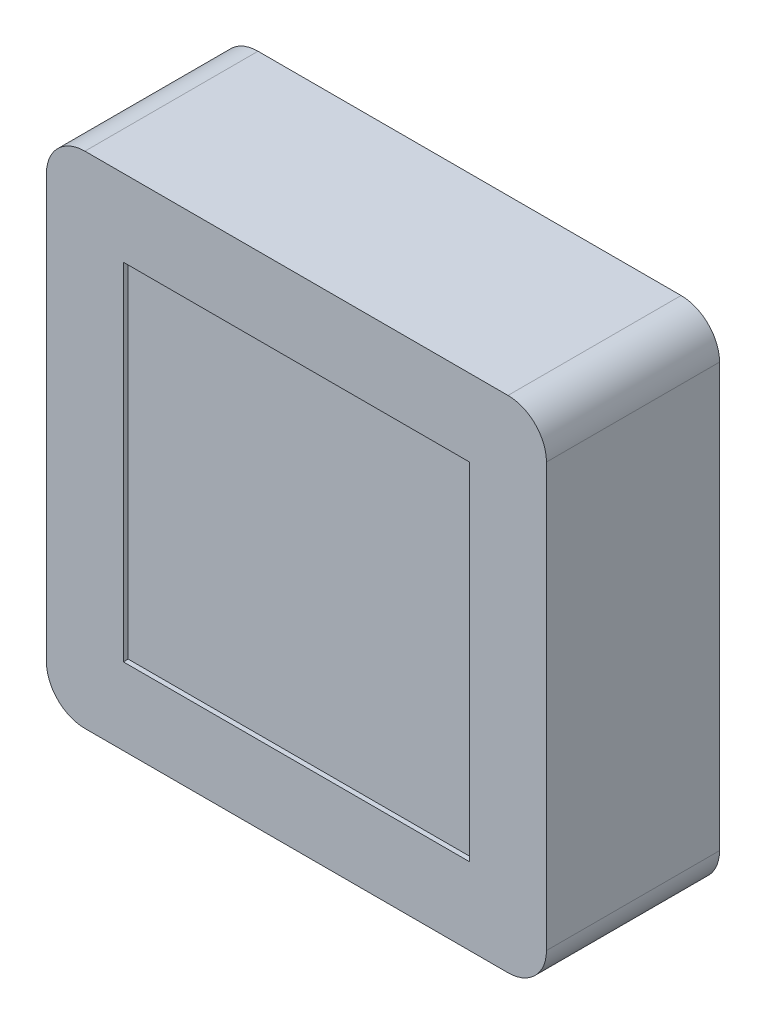
ISO-10303-21;
HEADER;
FILE_DESCRIPTION(('STEP AP214'),'2;1');
FILE_NAME('part.step','',(''),(''),'','','');
FILE_SCHEMA(('AUTOMOTIVE_DESIGN { 1 0 10303 214 1 1 1 1 }'));
ENDSEC;
DATA;
#1=APPLICATION_CONTEXT('core data for automotive mechanical design processes');
#2=APPLICATION_PROTOCOL_DEFINITION('international standard','automotive_design',2000,#1);
#3=PRODUCT_CONTEXT('',#1,'mechanical');
#4=PRODUCT('Part','Part','',(#3));
#5=PRODUCT_RELATED_PRODUCT_CATEGORY('part','',(#4));
#6=PRODUCT_DEFINITION_FORMATION('','',#4);
#7=PRODUCT_DEFINITION_CONTEXT('part definition',#1,'design');
#8=PRODUCT_DEFINITION('design','',#6,#7);
#9=PRODUCT_DEFINITION_SHAPE('','',#8);
#10=(LENGTH_UNIT() NAMED_UNIT(*) SI_UNIT(.MILLI.,.METRE.));
#11=(NAMED_UNIT(*) PLANE_ANGLE_UNIT() SI_UNIT($,.RADIAN.));
#12=(NAMED_UNIT(*) SI_UNIT($,.STERADIAN.) SOLID_ANGLE_UNIT());
#13=UNCERTAINTY_MEASURE_WITH_UNIT(LENGTH_MEASURE(1.E-05),#10,'distance_accuracy_value','');
#14=(GEOMETRIC_REPRESENTATION_CONTEXT(3) GLOBAL_UNCERTAINTY_ASSIGNED_CONTEXT((#13)) GLOBAL_UNIT_ASSIGNED_CONTEXT((#10,
#11,#12)) REPRESENTATION_CONTEXT('',''));
#15=CARTESIAN_POINT('',(0.,0.,0.));
#16=DIRECTION('',(0.,0.,1.));
#17=DIRECTION('',(1.,0.,0.));
#18=AXIS2_PLACEMENT_3D('',#15,#16,#17);
#19=CARTESIAN_POINT('',(-13.,13.,4.5));
#20=DIRECTION('',(1.,0.,0.));
#21=DIRECTION('',(0.,0.,-1.));
#22=AXIS2_PLACEMENT_3D('',#19,#20,#21);
#23=PLANE('',#22);
#24=DIRECTION('',(0.,-1.,0.));
#25=VECTOR('',#24,1.);
#26=CARTESIAN_POINT('',(-13.,13.,-4.5));
#27=LINE('',#26,#25);
#28=CARTESIAN_POINT('',(-13.,11.,-4.5));
#29=VERTEX_POINT('',#28);
#30=CARTESIAN_POINT('',(-13.,-11.,-4.5));
#31=VERTEX_POINT('',#30);
#32=EDGE_CURVE('E157',#29,#31,#27,.T.);
#33=ORIENTED_EDGE('',*,*,#32,.T.);
#34=DIRECTION('',(0.,0.,-1.));
#35=VECTOR('',#34,1.);
#36=CARTESIAN_POINT('',(-13.,-11.,4.5));
#37=LINE('',#36,#35);
#38=CARTESIAN_POINT('',(-13.,-11.,4.5));
#39=VERTEX_POINT('',#38);
#40=EDGE_CURVE('E199',#31,#39,#37,.F.);
#41=ORIENTED_EDGE('',*,*,#40,.T.);
#42=DIRECTION('',(0.,-1.,0.));
#43=VECTOR('',#42,1.);
#44=CARTESIAN_POINT('',(-13.,13.,4.5));
#45=LINE('',#44,#43);
#46=CARTESIAN_POINT('',(-13.,11.,4.5));
#47=VERTEX_POINT('',#46);
#48=EDGE_CURVE('E162',#47,#39,#45,.T.);
#49=ORIENTED_EDGE('',*,*,#48,.F.);
#50=DIRECTION('',(0.,0.,-1.));
#51=VECTOR('',#50,1.);
#52=CARTESIAN_POINT('',(-13.,11.,4.5));
#53=LINE('',#52,#51);
#54=EDGE_CURVE('E196',#47,#29,#53,.T.);
#55=ORIENTED_EDGE('',*,*,#54,.T.);
#56=EDGE_LOOP('',(#33,#41,#49,#55));
#57=FACE_BOUND('',#56,.T.);
#58=ADVANCED_FACE('F34',(#57),#23,.F.);
#59=CARTESIAN_POINT('',(-13.,-13.,4.5));
#60=DIRECTION('',(0.,1.,0.));
#61=DIRECTION('',(0.,0.,1.));
#62=AXIS2_PLACEMENT_3D('',#59,#60,#61);
#63=PLANE('',#62);
#64=DIRECTION('',(1.,0.,0.));
#65=VECTOR('',#64,1.);
#66=CARTESIAN_POINT('',(-13.,-13.,4.5));
#67=LINE('',#66,#65);
#68=CARTESIAN_POINT('',(-11.,-13.,4.5));
#69=VERTEX_POINT('',#68);
#70=CARTESIAN_POINT('',(11.,-13.,4.5));
#71=VERTEX_POINT('',#70);
#72=EDGE_CURVE('E165',#69,#71,#67,.T.);
#73=ORIENTED_EDGE('',*,*,#72,.F.);
#74=DIRECTION('',(0.,0.,-1.));
#75=VECTOR('',#74,1.);
#76=CARTESIAN_POINT('',(-11.,-13.,4.5));
#77=LINE('',#76,#75);
#78=CARTESIAN_POINT('',(-11.,-13.,-4.5));
#79=VERTEX_POINT('',#78);
#80=EDGE_CURVE('E185',#69,#79,#77,.T.);
#81=ORIENTED_EDGE('',*,*,#80,.T.);
#82=DIRECTION('',(1.,0.,0.));
#83=VECTOR('',#82,1.);
#84=CARTESIAN_POINT('',(-13.,-13.,-4.5));
#85=LINE('',#84,#83);
#86=CARTESIAN_POINT('',(11.,-13.,-4.5));
#87=VERTEX_POINT('',#86);
#88=EDGE_CURVE('E177',#79,#87,#85,.T.);
#89=ORIENTED_EDGE('',*,*,#88,.T.);
#90=DIRECTION('',(0.,0.,-1.));
#91=VECTOR('',#90,1.);
#92=CARTESIAN_POINT('',(11.,-13.,4.5));
#93=LINE('',#92,#91);
#94=EDGE_CURVE('E174',#87,#71,#93,.F.);
#95=ORIENTED_EDGE('',*,*,#94,.T.);
#96=EDGE_LOOP('',(#73,#81,#89,#95));
#97=FACE_BOUND('',#96,.T.);
#98=ADVANCED_FACE('F242',(#97),#63,.F.);
#99=CARTESIAN_POINT('',(13.,13.,4.5));
#100=DIRECTION('',(-1.,0.,0.));
#101=DIRECTION('',(0.,0.,1.));
#102=AXIS2_PLACEMENT_3D('',#99,#100,#101);
#103=PLANE('',#102);
#104=DIRECTION('',(0.,1.,0.));
#105=VECTOR('',#104,1.);
#106=CARTESIAN_POINT('',(13.,13.,4.5));
#107=LINE('',#106,#105);
#108=CARTESIAN_POINT('',(13.,-11.,4.5));
#109=VERTEX_POINT('',#108);
#110=CARTESIAN_POINT('',(13.,11.,4.5));
#111=VERTEX_POINT('',#110);
#112=EDGE_CURVE('E169',#109,#111,#107,.T.);
#113=ORIENTED_EDGE('',*,*,#112,.F.);
#114=DIRECTION('',(0.,0.,-1.));
#115=VECTOR('',#114,1.);
#116=CARTESIAN_POINT('',(13.,-11.,4.5));
#117=LINE('',#116,#115);
#118=CARTESIAN_POINT('',(13.,-11.,-4.5));
#119=VERTEX_POINT('',#118);
#120=EDGE_CURVE('E211',#109,#119,#117,.T.);
#121=ORIENTED_EDGE('',*,*,#120,.T.);
#122=DIRECTION('',(0.,1.,0.));
#123=VECTOR('',#122,1.);
#124=CARTESIAN_POINT('',(13.,13.,-4.5));
#125=LINE('',#124,#123);
#126=CARTESIAN_POINT('',(13.,11.,-4.5));
#127=VERTEX_POINT('',#126);
#128=EDGE_CURVE('E180',#119,#127,#125,.T.);
#129=ORIENTED_EDGE('',*,*,#128,.T.);
#130=DIRECTION('',(0.,0.,-1.));
#131=VECTOR('',#130,1.);
#132=CARTESIAN_POINT('',(13.,11.,4.5));
#133=LINE('',#132,#131);
#134=EDGE_CURVE('E209',#127,#111,#133,.F.);
#135=ORIENTED_EDGE('',*,*,#134,.T.);
#136=EDGE_LOOP('',(#113,#121,#129,#135));
#137=FACE_BOUND('',#136,.T.);
#138=ADVANCED_FACE('F252',(#137),#103,.F.);
#139=CARTESIAN_POINT('',(-13.,13.,4.5));
#140=DIRECTION('',(0.,-1.,0.));
#141=DIRECTION('',(0.,0.,-1.));
#142=AXIS2_PLACEMENT_3D('',#139,#140,#141);
#143=PLANE('',#142);
#144=DIRECTION('',(-1.,0.,0.));
#145=VECTOR('',#144,1.);
#146=CARTESIAN_POINT('',(-13.,13.,-4.5));
#147=LINE('',#146,#145);
#148=CARTESIAN_POINT('',(11.,13.,-4.5));
#149=VERTEX_POINT('',#148);
#150=CARTESIAN_POINT('',(-11.,13.,-4.5));
#151=VERTEX_POINT('',#150);
#152=EDGE_CURVE('E166',#149,#151,#147,.T.);
#153=ORIENTED_EDGE('',*,*,#152,.T.);
#154=DIRECTION('',(0.,0.,-1.));
#155=VECTOR('',#154,1.);
#156=CARTESIAN_POINT('',(-11.,13.,4.5));
#157=LINE('',#156,#155);
#158=CARTESIAN_POINT('',(-11.,13.,4.5));
#159=VERTEX_POINT('',#158);
#160=EDGE_CURVE('E57',#151,#159,#157,.F.);
#161=ORIENTED_EDGE('',*,*,#160,.T.);
#162=DIRECTION('',(-1.,0.,0.));
#163=VECTOR('',#162,1.);
#164=CARTESIAN_POINT('',(-13.,13.,4.5));
#165=LINE('',#164,#163);
#166=CARTESIAN_POINT('',(11.,13.,4.5));
#167=VERTEX_POINT('',#166);
#168=EDGE_CURVE('E172',#167,#159,#165,.T.);
#169=ORIENTED_EDGE('',*,*,#168,.F.);
#170=DIRECTION('',(0.,0.,-1.));
#171=VECTOR('',#170,1.);
#172=CARTESIAN_POINT('',(11.,13.,4.5));
#173=LINE('',#172,#171);
#174=EDGE_CURVE('E214',#167,#149,#173,.T.);
#175=ORIENTED_EDGE('',*,*,#174,.T.);
#176=EDGE_LOOP('',(#153,#161,#169,#175));
#177=FACE_BOUND('',#176,.T.);
#178=ADVANCED_FACE('F257',(#177),#143,.F.);
#179=CARTESIAN_POINT('',(0.,0.,4.5));
#180=DIRECTION('',(0.,0.,1.));
#181=DIRECTION('',(1.,0.,0.));
#182=AXIS2_PLACEMENT_3D('',#179,#180,#181);
#183=PLANE('',#182);
#184=DIRECTION('',(0.,-1.,0.));
#185=VECTOR('',#184,1.);
#186=CARTESIAN_POINT('',(-9.,0.,4.5));
#187=LINE('',#186,#185);
#188=CARTESIAN_POINT('',(-9.,9.,4.5));
#189=VERTEX_POINT('',#188);
#190=CARTESIAN_POINT('',(-9.,-9.,4.5));
#191=VERTEX_POINT('',#190);
#192=EDGE_CURVE('E130',#189,#191,#187,.T.);
#193=ORIENTED_EDGE('',*,*,#192,.F.);
#194=DIRECTION('',(-1.,0.,0.));
#195=VECTOR('',#194,1.);
#196=CARTESIAN_POINT('',(0.,9.,4.5));
#197=LINE('',#196,#195);
#198=CARTESIAN_POINT('',(9.,9.,4.5));
#199=VERTEX_POINT('',#198);
#200=EDGE_CURVE('E222',#199,#189,#197,.T.);
#201=ORIENTED_EDGE('',*,*,#200,.F.);
#202=DIRECTION('',(0.,1.,0.));
#203=VECTOR('',#202,1.);
#204=CARTESIAN_POINT('',(9.,0.,4.5));
#205=LINE('',#204,#203);
#206=CARTESIAN_POINT('',(9.,-9.,4.5));
#207=VERTEX_POINT('',#206);
#208=EDGE_CURVE('E220',#207,#199,#205,.T.);
#209=ORIENTED_EDGE('',*,*,#208,.F.);
#210=DIRECTION('',(1.,0.,0.));
#211=VECTOR('',#210,1.);
#212=CARTESIAN_POINT('',(0.,-9.,4.5));
#213=LINE('',#212,#211);
#214=EDGE_CURVE('E218',#191,#207,#213,.T.);
#215=ORIENTED_EDGE('',*,*,#214,.F.);
#216=EDGE_LOOP('',(#193,#201,#209,#215));
#217=FACE_BOUND('',#216,.T.);
#218=ORIENTED_EDGE('',*,*,#48,.T.);
#219=CARTESIAN_POINT('',(-11.,-11.,4.5));
#220=DIRECTION('',(0.,0.,1.));
#221=DIRECTION('',(1.,0.,0.));
#222=AXIS2_PLACEMENT_3D('',#219,#220,#221);
#223=CIRCLE('',#222,2.);
#224=EDGE_CURVE('E207',#39,#69,#223,.T.);
#225=ORIENTED_EDGE('',*,*,#224,.T.);
#226=ORIENTED_EDGE('',*,*,#72,.T.);
#227=CARTESIAN_POINT('',(11.,-11.,4.5));
#228=DIRECTION('',(0.,0.,1.));
#229=DIRECTION('',(1.,0.,0.));
#230=AXIS2_PLACEMENT_3D('',#227,#228,#229);
#231=CIRCLE('',#230,2.);
#232=EDGE_CURVE('E205',#71,#109,#231,.T.);
#233=ORIENTED_EDGE('',*,*,#232,.T.);
#234=ORIENTED_EDGE('',*,*,#112,.T.);
#235=CARTESIAN_POINT('',(11.,11.,4.5));
#236=DIRECTION('',(0.,0.,1.));
#237=DIRECTION('',(1.,0.,0.));
#238=AXIS2_PLACEMENT_3D('',#235,#236,#237);
#239=CIRCLE('',#238,2.);
#240=EDGE_CURVE('E201',#111,#167,#239,.T.);
#241=ORIENTED_EDGE('',*,*,#240,.T.);
#242=ORIENTED_EDGE('',*,*,#168,.T.);
#243=CARTESIAN_POINT('',(-11.,11.,4.5));
#244=DIRECTION('',(0.,0.,1.));
#245=DIRECTION('',(1.,0.,0.));
#246=AXIS2_PLACEMENT_3D('',#243,#244,#245);
#247=CIRCLE('',#246,2.);
#248=EDGE_CURVE('E203',#159,#47,#247,.T.);
#249=ORIENTED_EDGE('',*,*,#248,.T.);
#250=EDGE_LOOP('',(#218,#225,#226,#233,#234,#241,#242,#249));
#251=FACE_BOUND('',#250,.T.);
#252=ADVANCED_FACE('F233',(#217,#251),#183,.T.);
#253=CARTESIAN_POINT('',(0.,0.,-4.5));
#254=DIRECTION('',(0.,0.,1.));
#255=DIRECTION('',(1.,0.,0.));
#256=AXIS2_PLACEMENT_3D('',#253,#254,#255);
#257=PLANE('',#256);
#258=CARTESIAN_POINT('',(-9.,0.,-4.5));
#259=DIRECTION('',(0.,0.,1.));
#260=DIRECTION('',(1.,0.,0.));
#261=AXIS2_PLACEMENT_3D('',#258,#259,#260);
#262=CIRCLE('',#261,0.949999999999999);
#263=CARTESIAN_POINT('',(-8.05,0.,-4.5));
#264=VERTEX_POINT('',#263);
#265=EDGE_CURVE('E11',#264,#264,#262,.F.);
#266=ORIENTED_EDGE('',*,*,#265,.F.);
#267=EDGE_LOOP('',(#266));
#268=FACE_BOUND('',#267,.T.);
#269=CARTESIAN_POINT('',(9.,0.,-4.5));
#270=DIRECTION('',(0.,0.,1.));
#271=DIRECTION('',(1.,0.,0.));
#272=AXIS2_PLACEMENT_3D('',#269,#270,#271);
#273=CIRCLE('',#272,0.949999999999999);
#274=CARTESIAN_POINT('',(9.95,0.,-4.5));
#275=VERTEX_POINT('',#274);
#276=EDGE_CURVE('E42',#275,#275,#273,.F.);
#277=ORIENTED_EDGE('',*,*,#276,.F.);
#278=EDGE_LOOP('',(#277));
#279=FACE_BOUND('',#278,.T.);
#280=ORIENTED_EDGE('',*,*,#88,.F.);
#281=CARTESIAN_POINT('',(-11.,-11.,-4.5));
#282=DIRECTION('',(0.,0.,1.));
#283=DIRECTION('',(1.,0.,0.));
#284=AXIS2_PLACEMENT_3D('',#281,#282,#283);
#285=CIRCLE('',#284,2.);
#286=EDGE_CURVE('E194',#79,#31,#285,.F.);
#287=ORIENTED_EDGE('',*,*,#286,.T.);
#288=ORIENTED_EDGE('',*,*,#32,.F.);
#289=CARTESIAN_POINT('',(-11.,11.,-4.5));
#290=DIRECTION('',(0.,0.,1.));
#291=DIRECTION('',(1.,0.,0.));
#292=AXIS2_PLACEMENT_3D('',#289,#290,#291);
#293=CIRCLE('',#292,2.);
#294=EDGE_CURVE('E190',#29,#151,#293,.F.);
#295=ORIENTED_EDGE('',*,*,#294,.T.);
#296=ORIENTED_EDGE('',*,*,#152,.F.);
#297=CARTESIAN_POINT('',(11.,11.,-4.5));
#298=DIRECTION('',(0.,0.,1.));
#299=DIRECTION('',(1.,0.,0.));
#300=AXIS2_PLACEMENT_3D('',#297,#298,#299);
#301=CIRCLE('',#300,2.);
#302=EDGE_CURVE('E188',#149,#127,#301,.F.);
#303=ORIENTED_EDGE('',*,*,#302,.T.);
#304=ORIENTED_EDGE('',*,*,#128,.F.);
#305=CARTESIAN_POINT('',(11.,-11.,-4.5));
#306=DIRECTION('',(0.,0.,1.));
#307=DIRECTION('',(1.,0.,0.));
#308=AXIS2_PLACEMENT_3D('',#305,#306,#307);
#309=CIRCLE('',#308,2.);
#310=EDGE_CURVE('E192',#119,#87,#309,.F.);
#311=ORIENTED_EDGE('',*,*,#310,.T.);
#312=EDGE_LOOP('',(#280,#287,#288,#295,#296,#303,#304,#311));
#313=FACE_BOUND('',#312,.T.);
#314=ADVANCED_FACE('F229',(#268,#279,#313),#257,.F.);
#315=CARTESIAN_POINT('',(-11.,-11.,4.5));
#316=DIRECTION('',(0.,0.,-1.));
#317=DIRECTION('',(-1.,0.,0.));
#318=AXIS2_PLACEMENT_3D('',#315,#316,#317);
#319=CYLINDRICAL_SURFACE('',#318,2.);
#320=ORIENTED_EDGE('',*,*,#224,.F.);
#321=ORIENTED_EDGE('',*,*,#40,.F.);
#322=ORIENTED_EDGE('',*,*,#286,.F.);
#323=ORIENTED_EDGE('',*,*,#80,.F.);
#324=EDGE_LOOP('',(#320,#321,#322,#323));
#325=FACE_BOUND('',#324,.T.);
#326=ADVANCED_FACE('F232',(#325),#319,.T.);
#327=CARTESIAN_POINT('',(11.,-11.,4.5));
#328=DIRECTION('',(0.,0.,-1.));
#329=DIRECTION('',(-1.,0.,0.));
#330=AXIS2_PLACEMENT_3D('',#327,#328,#329);
#331=CYLINDRICAL_SURFACE('',#330,2.);
#332=ORIENTED_EDGE('',*,*,#232,.F.);
#333=ORIENTED_EDGE('',*,*,#94,.F.);
#334=ORIENTED_EDGE('',*,*,#310,.F.);
#335=ORIENTED_EDGE('',*,*,#120,.F.);
#336=EDGE_LOOP('',(#332,#333,#334,#335));
#337=FACE_BOUND('',#336,.T.);
#338=ADVANCED_FACE('F246',(#337),#331,.T.);
#339=CARTESIAN_POINT('',(-11.,11.,4.5));
#340=DIRECTION('',(0.,0.,-1.));
#341=DIRECTION('',(-1.,0.,0.));
#342=AXIS2_PLACEMENT_3D('',#339,#340,#341);
#343=CYLINDRICAL_SURFACE('',#342,2.);
#344=ORIENTED_EDGE('',*,*,#248,.F.);
#345=ORIENTED_EDGE('',*,*,#160,.F.);
#346=ORIENTED_EDGE('',*,*,#294,.F.);
#347=ORIENTED_EDGE('',*,*,#54,.F.);
#348=EDGE_LOOP('',(#344,#345,#346,#347));
#349=FACE_BOUND('',#348,.T.);
#350=ADVANCED_FACE('F261',(#349),#343,.T.);
#351=CARTESIAN_POINT('',(11.,11.,4.5));
#352=DIRECTION('',(0.,0.,-1.));
#353=DIRECTION('',(-1.,0.,0.));
#354=AXIS2_PLACEMENT_3D('',#351,#352,#353);
#355=CYLINDRICAL_SURFACE('',#354,2.);
#356=ORIENTED_EDGE('',*,*,#240,.F.);
#357=ORIENTED_EDGE('',*,*,#134,.F.);
#358=ORIENTED_EDGE('',*,*,#302,.F.);
#359=ORIENTED_EDGE('',*,*,#174,.F.);
#360=EDGE_LOOP('',(#356,#357,#358,#359));
#361=FACE_BOUND('',#360,.T.);
#362=ADVANCED_FACE('F36',(#361),#355,.T.);
#363=CARTESIAN_POINT('',(-9.,9.,4.25));
#364=DIRECTION('',(-1.,0.,0.));
#365=DIRECTION('',(0.,-1.,0.));
#366=AXIS2_PLACEMENT_3D('',#363,#364,#365);
#367=PLANE('',#366);
#368=ORIENTED_EDGE('',*,*,#192,.T.);
#369=DIRECTION('',(0.,0.,1.));
#370=VECTOR('',#369,1.);
#371=CARTESIAN_POINT('',(-9.,-9.,4.25));
#372=LINE('',#371,#370);
#373=CARTESIAN_POINT('',(-9.,-9.,4.25));
#374=VERTEX_POINT('',#373);
#375=EDGE_CURVE('E49',#374,#191,#372,.T.);
#376=ORIENTED_EDGE('',*,*,#375,.F.);
#377=DIRECTION('',(0.,-1.,0.));
#378=VECTOR('',#377,1.);
#379=CARTESIAN_POINT('',(-9.,9.,4.25));
#380=LINE('',#379,#378);
#381=CARTESIAN_POINT('',(-9.,9.,4.25));
#382=VERTEX_POINT('',#381);
#383=EDGE_CURVE('E127',#382,#374,#380,.T.);
#384=ORIENTED_EDGE('',*,*,#383,.F.);
#385=DIRECTION('',(0.,0.,1.));
#386=VECTOR('',#385,1.);
#387=CARTESIAN_POINT('',(-9.,9.,4.25));
#388=LINE('',#387,#386);
#389=EDGE_CURVE('E155',#382,#189,#388,.T.);
#390=ORIENTED_EDGE('',*,*,#389,.T.);
#391=EDGE_LOOP('',(#368,#376,#384,#390));
#392=FACE_BOUND('',#391,.T.);
#393=ADVANCED_FACE('F124',(#392),#367,.F.);
#394=CARTESIAN_POINT('',(-9.,9.,4.25));
#395=DIRECTION('',(0.,1.,0.));
#396=DIRECTION('',(0.,0.,1.));
#397=AXIS2_PLACEMENT_3D('',#394,#395,#396);
#398=PLANE('',#397);
#399=ORIENTED_EDGE('',*,*,#200,.T.);
#400=ORIENTED_EDGE('',*,*,#389,.F.);
#401=DIRECTION('',(-1.,0.,0.));
#402=VECTOR('',#401,1.);
#403=CARTESIAN_POINT('',(-9.,9.,4.25));
#404=LINE('',#403,#402);
#405=CARTESIAN_POINT('',(9.,9.,4.25));
#406=VERTEX_POINT('',#405);
#407=EDGE_CURVE('E133',#406,#382,#404,.T.);
#408=ORIENTED_EDGE('',*,*,#407,.F.);
#409=DIRECTION('',(0.,0.,1.));
#410=VECTOR('',#409,1.);
#411=CARTESIAN_POINT('',(9.,9.,4.25));
#412=LINE('',#411,#410);
#413=EDGE_CURVE('E158',#406,#199,#412,.T.);
#414=ORIENTED_EDGE('',*,*,#413,.T.);
#415=EDGE_LOOP('',(#399,#400,#408,#414));
#416=FACE_BOUND('',#415,.T.);
#417=ADVANCED_FACE('F289',(#416),#398,.F.);
#418=CARTESIAN_POINT('',(9.,9.,4.25));
#419=DIRECTION('',(1.,0.,0.));
#420=DIRECTION('',(0.,1.,0.));
#421=AXIS2_PLACEMENT_3D('',#418,#419,#420);
#422=PLANE('',#421);
#423=ORIENTED_EDGE('',*,*,#208,.T.);
#424=ORIENTED_EDGE('',*,*,#413,.F.);
#425=DIRECTION('',(0.,1.,0.));
#426=VECTOR('',#425,1.);
#427=CARTESIAN_POINT('',(9.,9.,4.25));
#428=LINE('',#427,#426);
#429=CARTESIAN_POINT('',(9.,-9.,4.25));
#430=VERTEX_POINT('',#429);
#431=EDGE_CURVE('E142',#430,#406,#428,.T.);
#432=ORIENTED_EDGE('',*,*,#431,.F.);
#433=DIRECTION('',(0.,0.,1.));
#434=VECTOR('',#433,1.);
#435=CARTESIAN_POINT('',(9.,-9.,4.25));
#436=LINE('',#435,#434);
#437=EDGE_CURVE('E132',#430,#207,#436,.T.);
#438=ORIENTED_EDGE('',*,*,#437,.T.);
#439=EDGE_LOOP('',(#423,#424,#432,#438));
#440=FACE_BOUND('',#439,.T.);
#441=ADVANCED_FACE('F292',(#440),#422,.F.);
#442=CARTESIAN_POINT('',(-9.,-9.,4.25));
#443=DIRECTION('',(0.,-1.,0.));
#444=DIRECTION('',(0.,0.,-1.));
#445=AXIS2_PLACEMENT_3D('',#442,#443,#444);
#446=PLANE('',#445);
#447=ORIENTED_EDGE('',*,*,#214,.T.);
#448=ORIENTED_EDGE('',*,*,#437,.F.);
#449=DIRECTION('',(1.,0.,0.));
#450=VECTOR('',#449,1.);
#451=CARTESIAN_POINT('',(-9.,-9.,4.25));
#452=LINE('',#451,#450);
#453=EDGE_CURVE('E136',#374,#430,#452,.T.);
#454=ORIENTED_EDGE('',*,*,#453,.F.);
#455=ORIENTED_EDGE('',*,*,#375,.T.);
#456=EDGE_LOOP('',(#447,#448,#454,#455));
#457=FACE_BOUND('',#456,.T.);
#458=ADVANCED_FACE('F137',(#457),#446,.F.);
#459=CARTESIAN_POINT('',(0.,0.,4.25));
#460=DIRECTION('',(0.,0.,1.));
#461=DIRECTION('',(1.,0.,0.));
#462=AXIS2_PLACEMENT_3D('',#459,#460,#461);
#463=PLANE('',#462);
#464=ORIENTED_EDGE('',*,*,#383,.T.);
#465=ORIENTED_EDGE('',*,*,#453,.T.);
#466=ORIENTED_EDGE('',*,*,#431,.T.);
#467=ORIENTED_EDGE('',*,*,#407,.T.);
#468=EDGE_LOOP('',(#464,#465,#466,#467));
#469=FACE_BOUND('',#468,.T.);
#470=ADVANCED_FACE('F144',(#469),#463,.T.);
#471=CARTESIAN_POINT('',(9.,0.,-6.));
#472=DIRECTION('',(0.,0.,1.));
#473=DIRECTION('',(1.,0.,0.));
#474=AXIS2_PLACEMENT_3D('',#471,#472,#473);
#475=CYLINDRICAL_SURFACE('',#474,0.949999999999999);
#476=CARTESIAN_POINT('',(9.,0.,-6.));
#477=DIRECTION('',(0.,0.,-1.));
#478=DIRECTION('',(-1.,0.,0.));
#479=AXIS2_PLACEMENT_3D('',#476,#477,#478);
#480=CIRCLE('',#479,0.949999999999999);
#481=CARTESIAN_POINT('',(8.05,0.,-6.));
#482=VERTEX_POINT('',#481);
#483=EDGE_CURVE('E146',#482,#482,#480,.T.);
#484=ORIENTED_EDGE('',*,*,#483,.F.);
#485=EDGE_LOOP('',(#484));
#486=FACE_BOUND('',#485,.T.);
#487=ORIENTED_EDGE('',*,*,#276,.T.);
#488=EDGE_LOOP('',(#487));
#489=FACE_BOUND('',#488,.T.);
#490=ADVANCED_FACE('F227',(#486,#489),#475,.T.);
#491=CARTESIAN_POINT('',(9.,0.,-6.));
#492=DIRECTION('',(0.,0.,-1.));
#493=DIRECTION('',(-1.,0.,0.));
#494=AXIS2_PLACEMENT_3D('',#491,#492,#493);
#495=PLANE('',#494);
#496=ORIENTED_EDGE('',*,*,#483,.T.);
#497=EDGE_LOOP('',(#496));
#498=FACE_BOUND('',#497,.T.);
#499=ADVANCED_FACE('F303',(#498),#495,.T.);
#500=CARTESIAN_POINT('',(-9.,0.,-6.));
#501=DIRECTION('',(0.,0.,1.));
#502=DIRECTION('',(1.,0.,0.));
#503=AXIS2_PLACEMENT_3D('',#500,#501,#502);
#504=CYLINDRICAL_SURFACE('',#503,0.949999999999999);
#505=CARTESIAN_POINT('',(-9.,0.,-6.));
#506=DIRECTION('',(0.,0.,-1.));
#507=DIRECTION('',(1.,0.,0.));
#508=AXIS2_PLACEMENT_3D('',#505,#506,#507);
#509=CIRCLE('',#508,0.949999999999999);
#510=CARTESIAN_POINT('',(-8.05,0.,-6.));
#511=VERTEX_POINT('',#510);
#512=EDGE_CURVE('E149',#511,#511,#509,.T.);
#513=ORIENTED_EDGE('',*,*,#512,.F.);
#514=EDGE_LOOP('',(#513));
#515=FACE_BOUND('',#514,.T.);
#516=ORIENTED_EDGE('',*,*,#265,.T.);
#517=EDGE_LOOP('',(#516));
#518=FACE_BOUND('',#517,.T.);
#519=ADVANCED_FACE('F307',(#515,#518),#504,.T.);
#520=CARTESIAN_POINT('',(-9.,0.,-6.));
#521=DIRECTION('',(0.,0.,1.));
#522=DIRECTION('',(1.,0.,0.));
#523=AXIS2_PLACEMENT_3D('',#520,#521,#522);
#524=PLANE('',#523);
#525=ORIENTED_EDGE('',*,*,#512,.T.);
#526=EDGE_LOOP('',(#525));
#527=FACE_BOUND('',#526,.T.);
#528=ADVANCED_FACE('F311',(#527),#524,.F.);
#529=CLOSED_SHELL('',(#58,#98,#138,#178,#252,#314,#326,#338,#350,#362,#393,#417,#441,#458,#470,
#490,#499,#519,#528));
#530=MANIFOLD_SOLID_BREP('B2',#529);
#531=ADVANCED_BREP_SHAPE_REPRESENTATION('',(#18,#530),#14);
#532=SHAPE_DEFINITION_REPRESENTATION(#9,#531);
ENDSEC;
END-ISO-10303-21;
